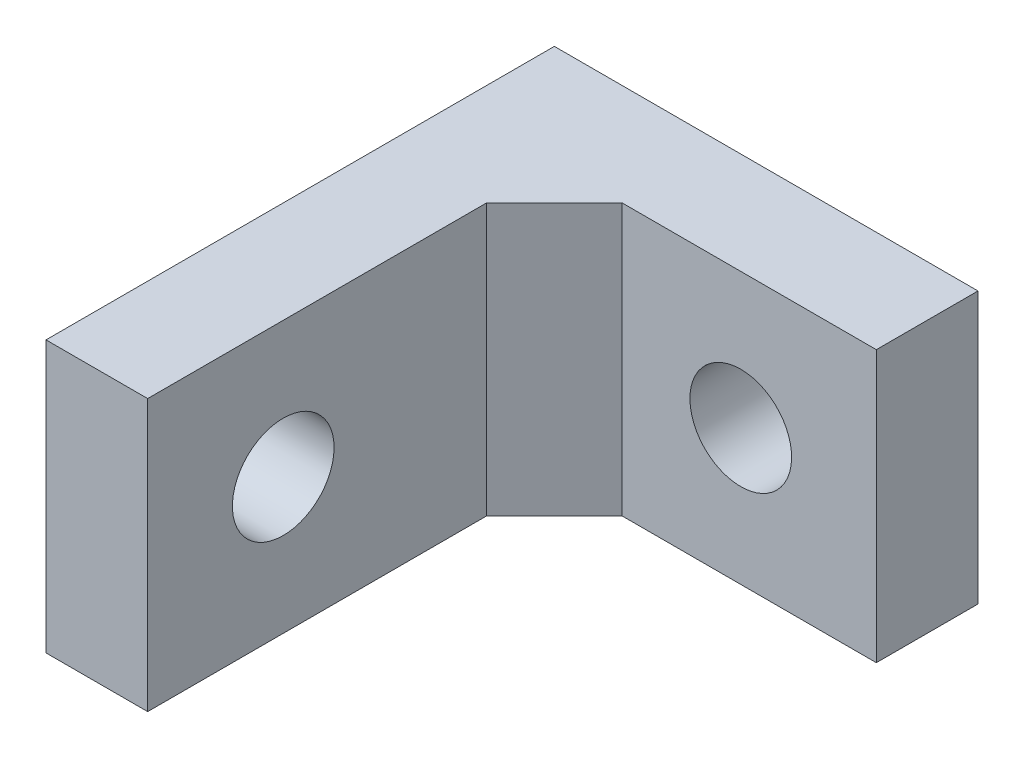
ISO-10303-21;
HEADER;
FILE_DESCRIPTION(('STEP AP214'),'2;1');
FILE_NAME('part.step','',(''),(''),'','','');
FILE_SCHEMA(('AUTOMOTIVE_DESIGN { 1 0 10303 214 1 1 1 1 }'));
ENDSEC;
DATA;
#1=APPLICATION_CONTEXT('core data for automotive mechanical design processes');
#2=APPLICATION_PROTOCOL_DEFINITION('international standard','automotive_design',2000,#1);
#3=PRODUCT_CONTEXT('',#1,'mechanical');
#4=PRODUCT('Part','Part','',(#3));
#5=PRODUCT_RELATED_PRODUCT_CATEGORY('part','',(#4));
#6=PRODUCT_DEFINITION_FORMATION('','',#4);
#7=PRODUCT_DEFINITION_CONTEXT('part definition',#1,'design');
#8=PRODUCT_DEFINITION('design','',#6,#7);
#9=PRODUCT_DEFINITION_SHAPE('','',#8);
#10=(LENGTH_UNIT() NAMED_UNIT(*) SI_UNIT(.MILLI.,.METRE.));
#11=(NAMED_UNIT(*) PLANE_ANGLE_UNIT() SI_UNIT($,.RADIAN.));
#12=(NAMED_UNIT(*) SI_UNIT($,.STERADIAN.) SOLID_ANGLE_UNIT());
#13=UNCERTAINTY_MEASURE_WITH_UNIT(LENGTH_MEASURE(1.E-05),#10,'distance_accuracy_value','');
#14=(GEOMETRIC_REPRESENTATION_CONTEXT(3) GLOBAL_UNCERTAINTY_ASSIGNED_CONTEXT((#13)) GLOBAL_UNIT_ASSIGNED_CONTEXT((#10,
#11,#12)) REPRESENTATION_CONTEXT('',''));
#15=CARTESIAN_POINT('',(0.,0.,0.));
#16=DIRECTION('',(0.,0.,1.));
#17=DIRECTION('',(1.,0.,0.));
#18=AXIS2_PLACEMENT_3D('',#15,#16,#17);
#19=CARTESIAN_POINT('',(3.,0.,0.));
#20=DIRECTION('',(1.,0.,0.));
#21=DIRECTION('',(0.,0.,-1.));
#22=AXIS2_PLACEMENT_3D('',#19,#20,#21);
#23=PLANE('',#22);
#24=DIRECTION('',(0.,0.,-1.));
#25=VECTOR('',#24,1.);
#26=CARTESIAN_POINT('',(3.,-8.,0.));
#27=LINE('',#26,#25);
#28=CARTESIAN_POINT('',(3.,-8.,0.));
#29=VERTEX_POINT('',#28);
#30=CARTESIAN_POINT('',(3.,-8.,-10.));
#31=VERTEX_POINT('',#30);
#32=EDGE_CURVE('E131',#29,#31,#27,.T.);
#33=ORIENTED_EDGE('',*,*,#32,.T.);
#34=DIRECTION('',(0.,1.,0.));
#35=VECTOR('',#34,1.);
#36=CARTESIAN_POINT('',(3.,0.,-10.));
#37=LINE('',#36,#35);
#38=CARTESIAN_POINT('',(3.,0.,-10.));
#39=VERTEX_POINT('',#38);
#40=EDGE_CURVE('E54',#31,#39,#37,.T.);
#41=ORIENTED_EDGE('',*,*,#40,.T.);
#42=DIRECTION('',(0.,0.,1.));
#43=VECTOR('',#42,1.);
#44=CARTESIAN_POINT('',(3.,0.,0.));
#45=LINE('',#44,#43);
#46=CARTESIAN_POINT('',(3.,0.,0.));
#47=VERTEX_POINT('',#46);
#48=EDGE_CURVE('E134',#39,#47,#45,.T.);
#49=ORIENTED_EDGE('',*,*,#48,.T.);
#50=DIRECTION('',(0.,-1.,0.));
#51=VECTOR('',#50,1.);
#52=CARTESIAN_POINT('',(3.,0.,0.));
#53=LINE('',#52,#51);
#54=EDGE_CURVE('E128',#47,#29,#53,.T.);
#55=ORIENTED_EDGE('',*,*,#54,.T.);
#56=EDGE_LOOP('',(#33,#41,#49,#55));
#57=FACE_BOUND('',#56,.T.);
#58=CARTESIAN_POINT('',(3.,-4.,-4.));
#59=DIRECTION('',(1.,0.,0.));
#60=DIRECTION('',(0.,0.,-1.));
#61=AXIS2_PLACEMENT_3D('',#58,#59,#60);
#62=CIRCLE('',#61,1.5);
#63=CARTESIAN_POINT('',(3.,-4.,-5.5));
#64=VERTEX_POINT('',#63);
#65=EDGE_CURVE('E122',#64,#64,#62,.T.);
#66=ORIENTED_EDGE('',*,*,#65,.F.);
#67=EDGE_LOOP('',(#66));
#68=FACE_BOUND('',#67,.T.);
#69=ADVANCED_FACE('F33',(#57,#68),#23,.T.);
#70=CARTESIAN_POINT('',(0.,0.,0.));
#71=DIRECTION('',(1.,0.,0.));
#72=DIRECTION('',(0.,0.,-1.));
#73=AXIS2_PLACEMENT_3D('',#70,#71,#72);
#74=PLANE('',#73);
#75=DIRECTION('',(0.,-1.,0.));
#76=VECTOR('',#75,1.);
#77=CARTESIAN_POINT('',(0.,0.,0.));
#78=LINE('',#77,#76);
#79=CARTESIAN_POINT('',(0.,0.,0.));
#80=VERTEX_POINT('',#79);
#81=CARTESIAN_POINT('',(0.,-8.,0.));
#82=VERTEX_POINT('',#81);
#83=EDGE_CURVE('E125',#80,#82,#78,.T.);
#84=ORIENTED_EDGE('',*,*,#83,.F.);
#85=DIRECTION('',(0.,0.,1.));
#86=VECTOR('',#85,1.);
#87=CARTESIAN_POINT('',(0.,0.,0.));
#88=LINE('',#87,#86);
#89=CARTESIAN_POINT('',(0.,0.,-15.));
#90=VERTEX_POINT('',#89);
#91=EDGE_CURVE('E132',#90,#80,#88,.T.);
#92=ORIENTED_EDGE('',*,*,#91,.F.);
#93=DIRECTION('',(0.,1.,0.));
#94=VECTOR('',#93,1.);
#95=CARTESIAN_POINT('',(0.,0.,-15.));
#96=LINE('',#95,#94);
#97=CARTESIAN_POINT('',(0.,-8.,-15.));
#98=VERTEX_POINT('',#97);
#99=EDGE_CURVE('E141',#98,#90,#96,.T.);
#100=ORIENTED_EDGE('',*,*,#99,.F.);
#101=DIRECTION('',(0.,0.,-1.));
#102=VECTOR('',#101,1.);
#103=CARTESIAN_POINT('',(0.,-8.,0.));
#104=LINE('',#103,#102);
#105=EDGE_CURVE('E139',#82,#98,#104,.T.);
#106=ORIENTED_EDGE('',*,*,#105,.F.);
#107=EDGE_LOOP('',(#84,#92,#100,#106));
#108=FACE_BOUND('',#107,.T.);
#109=CARTESIAN_POINT('',(0.,-4.,-4.));
#110=DIRECTION('',(1.,0.,0.));
#111=DIRECTION('',(0.,0.,-1.));
#112=AXIS2_PLACEMENT_3D('',#109,#110,#111);
#113=CIRCLE('',#112,1.5);
#114=CARTESIAN_POINT('',(0.,-4.,-5.5));
#115=VERTEX_POINT('',#114);
#116=EDGE_CURVE('E120',#115,#115,#113,.T.);
#117=ORIENTED_EDGE('',*,*,#116,.T.);
#118=EDGE_LOOP('',(#117));
#119=FACE_BOUND('',#118,.T.);
#120=ADVANCED_FACE('F166',(#108,#119),#74,.F.);
#121=CARTESIAN_POINT('',(3.,0.,0.));
#122=DIRECTION('',(0.,0.,-1.));
#123=DIRECTION('',(0.,1.,0.));
#124=AXIS2_PLACEMENT_3D('',#121,#122,#123);
#125=PLANE('',#124);
#126=ORIENTED_EDGE('',*,*,#83,.T.);
#127=DIRECTION('',(-1.,0.,0.));
#128=VECTOR('',#127,1.);
#129=CARTESIAN_POINT('',(3.,-8.,0.));
#130=LINE('',#129,#128);
#131=EDGE_CURVE('E151',#29,#82,#130,.T.);
#132=ORIENTED_EDGE('',*,*,#131,.F.);
#133=ORIENTED_EDGE('',*,*,#54,.F.);
#134=DIRECTION('',(-1.,0.,0.));
#135=VECTOR('',#134,1.);
#136=CARTESIAN_POINT('',(3.,0.,0.));
#137=LINE('',#136,#135);
#138=EDGE_CURVE('E136',#47,#80,#137,.T.);
#139=ORIENTED_EDGE('',*,*,#138,.T.);
#140=EDGE_LOOP('',(#126,#132,#133,#139));
#141=FACE_BOUND('',#140,.T.);
#142=ADVANCED_FACE('F170',(#141),#125,.F.);
#143=CARTESIAN_POINT('',(3.,-8.,0.));
#144=DIRECTION('',(0.,1.,0.));
#145=DIRECTION('',(0.,0.,1.));
#146=AXIS2_PLACEMENT_3D('',#143,#144,#145);
#147=PLANE('',#146);
#148=ORIENTED_EDGE('',*,*,#105,.T.);
#149=DIRECTION('',(-1.,0.,0.));
#150=VECTOR('',#149,1.);
#151=CARTESIAN_POINT('',(3.,-8.,-15.));
#152=LINE('',#151,#150);
#153=CARTESIAN_POINT('',(12.5,-8.,-15.));
#154=VERTEX_POINT('',#153);
#155=EDGE_CURVE('E148',#154,#98,#152,.T.);
#156=ORIENTED_EDGE('',*,*,#155,.F.);
#157=DIRECTION('',(0.,0.,-1.));
#158=VECTOR('',#157,1.);
#159=CARTESIAN_POINT('',(12.5,-8.,-12.));
#160=LINE('',#159,#158);
#161=CARTESIAN_POINT('',(12.5,-8.,-12.));
#162=VERTEX_POINT('',#161);
#163=EDGE_CURVE('E110',#162,#154,#160,.T.);
#164=ORIENTED_EDGE('',*,*,#163,.F.);
#165=DIRECTION('',(-1.,0.,0.));
#166=VECTOR('',#165,1.);
#167=CARTESIAN_POINT('',(0.,-8.,-12.));
#168=LINE('',#167,#166);
#169=CARTESIAN_POINT('',(5.00000000000001,-8.,-12.));
#170=VERTEX_POINT('',#169);
#171=EDGE_CURVE('E111',#162,#170,#168,.T.);
#172=ORIENTED_EDGE('',*,*,#171,.T.);
#173=DIRECTION('',(0.707106781186551,0.,-0.707106781186544));
#174=VECTOR('',#173,1.);
#175=CARTESIAN_POINT('',(-2.,-8.,-5.00000000000006));
#176=LINE('',#175,#174);
#177=EDGE_CURVE('E41',#170,#31,#176,.F.);
#178=ORIENTED_EDGE('',*,*,#177,.T.);
#179=ORIENTED_EDGE('',*,*,#32,.F.);
#180=ORIENTED_EDGE('',*,*,#131,.T.);
#181=EDGE_LOOP('',(#148,#156,#164,#172,#178,#179,#180));
#182=FACE_BOUND('',#181,.T.);
#183=ADVANCED_FACE('F157',(#182),#147,.F.);
#184=CARTESIAN_POINT('',(3.,0.,-15.));
#185=DIRECTION('',(0.,0.,1.));
#186=DIRECTION('',(0.,-1.,0.));
#187=AXIS2_PLACEMENT_3D('',#184,#185,#186);
#188=PLANE('',#187);
#189=ORIENTED_EDGE('',*,*,#99,.T.);
#190=DIRECTION('',(-1.,0.,0.));
#191=VECTOR('',#190,1.);
#192=CARTESIAN_POINT('',(3.,0.,-15.));
#193=LINE('',#192,#191);
#194=CARTESIAN_POINT('',(12.5,0.,-15.));
#195=VERTEX_POINT('',#194);
#196=EDGE_CURVE('E146',#195,#90,#193,.T.);
#197=ORIENTED_EDGE('',*,*,#196,.F.);
#198=DIRECTION('',(0.,-1.,0.));
#199=VECTOR('',#198,1.);
#200=CARTESIAN_POINT('',(12.5,0.,-15.));
#201=LINE('',#200,#199);
#202=EDGE_CURVE('E102',#195,#154,#201,.T.);
#203=ORIENTED_EDGE('',*,*,#202,.T.);
#204=ORIENTED_EDGE('',*,*,#155,.T.);
#205=EDGE_LOOP('',(#189,#197,#203,#204));
#206=FACE_BOUND('',#205,.T.);
#207=CARTESIAN_POINT('',(8.5,-4.,-15.));
#208=DIRECTION('',(0.,0.,-1.));
#209=DIRECTION('',(0.,1.,0.));
#210=AXIS2_PLACEMENT_3D('',#207,#208,#209);
#211=CIRCLE('',#210,1.5);
#212=CARTESIAN_POINT('',(8.5,-2.5,-15.));
#213=VERTEX_POINT('',#212);
#214=EDGE_CURVE('E275',#213,#213,#211,.T.);
#215=ORIENTED_EDGE('',*,*,#214,.F.);
#216=EDGE_LOOP('',(#215));
#217=FACE_BOUND('',#216,.T.);
#218=ADVANCED_FACE('F159',(#206,#217),#188,.F.);
#219=CARTESIAN_POINT('',(3.,0.,0.));
#220=DIRECTION('',(0.,-1.,0.));
#221=DIRECTION('',(0.,0.,-1.));
#222=AXIS2_PLACEMENT_3D('',#219,#220,#221);
#223=PLANE('',#222);
#224=ORIENTED_EDGE('',*,*,#48,.F.);
#225=DIRECTION('',(-0.707106781186551,0.,0.707106781186544));
#226=VECTOR('',#225,1.);
#227=CARTESIAN_POINT('',(-2.,0.,-5.00000000000006));
#228=LINE('',#227,#226);
#229=CARTESIAN_POINT('',(5.00000000000002,0.,-12.));
#230=VERTEX_POINT('',#229);
#231=EDGE_CURVE('E11',#39,#230,#228,.F.);
#232=ORIENTED_EDGE('',*,*,#231,.T.);
#233=DIRECTION('',(1.,0.,0.));
#234=VECTOR('',#233,1.);
#235=CARTESIAN_POINT('',(0.,0.,-12.));
#236=LINE('',#235,#234);
#237=CARTESIAN_POINT('',(12.5,0.,-12.));
#238=VERTEX_POINT('',#237);
#239=EDGE_CURVE('E90',#230,#238,#236,.T.);
#240=ORIENTED_EDGE('',*,*,#239,.T.);
#241=DIRECTION('',(0.,0.,-1.));
#242=VECTOR('',#241,1.);
#243=CARTESIAN_POINT('',(12.5,0.,-12.));
#244=LINE('',#243,#242);
#245=EDGE_CURVE('E94',#238,#195,#244,.T.);
#246=ORIENTED_EDGE('',*,*,#245,.T.);
#247=ORIENTED_EDGE('',*,*,#196,.T.);
#248=ORIENTED_EDGE('',*,*,#91,.T.);
#249=ORIENTED_EDGE('',*,*,#138,.F.);
#250=EDGE_LOOP('',(#224,#232,#240,#246,#247,#248,#249));
#251=FACE_BOUND('',#250,.T.);
#252=ADVANCED_FACE('F92',(#251),#223,.F.);
#253=CARTESIAN_POINT('',(3.,-4.,-4.));
#254=DIRECTION('',(-1.,0.,0.));
#255=DIRECTION('',(0.,0.,1.));
#256=AXIS2_PLACEMENT_3D('',#253,#254,#255);
#257=CYLINDRICAL_SURFACE('',#256,1.5);
#258=ORIENTED_EDGE('',*,*,#65,.T.);
#259=EDGE_LOOP('',(#258));
#260=FACE_BOUND('',#259,.T.);
#261=ORIENTED_EDGE('',*,*,#116,.F.);
#262=EDGE_LOOP('',(#261));
#263=FACE_BOUND('',#262,.T.);
#264=ADVANCED_FACE('F187',(#260,#263),#257,.F.);
#265=CARTESIAN_POINT('',(12.5,0.,-12.));
#266=DIRECTION('',(1.,0.,0.));
#267=DIRECTION('',(0.,1.,0.));
#268=AXIS2_PLACEMENT_3D('',#265,#266,#267);
#269=PLANE('',#268);
#270=ORIENTED_EDGE('',*,*,#202,.F.);
#271=ORIENTED_EDGE('',*,*,#245,.F.);
#272=DIRECTION('',(0.,-1.,0.));
#273=VECTOR('',#272,1.);
#274=CARTESIAN_POINT('',(12.5,0.,-12.));
#275=LINE('',#274,#273);
#276=EDGE_CURVE('E101',#238,#162,#275,.T.);
#277=ORIENTED_EDGE('',*,*,#276,.T.);
#278=ORIENTED_EDGE('',*,*,#163,.T.);
#279=EDGE_LOOP('',(#270,#271,#277,#278));
#280=FACE_BOUND('',#279,.T.);
#281=ADVANCED_FACE('F106',(#280),#269,.T.);
#282=CARTESIAN_POINT('',(0.,0.,-12.));
#283=DIRECTION('',(0.,0.,1.));
#284=DIRECTION('',(0.,-1.,0.));
#285=AXIS2_PLACEMENT_3D('',#282,#283,#284);
#286=PLANE('',#285);
#287=CARTESIAN_POINT('',(8.5,-4.,-12.));
#288=DIRECTION('',(0.,0.,-1.));
#289=DIRECTION('',(0.,1.,0.));
#290=AXIS2_PLACEMENT_3D('',#287,#288,#289);
#291=CIRCLE('',#290,1.5);
#292=CARTESIAN_POINT('',(8.5,-2.5,-12.));
#293=VERTEX_POINT('',#292);
#294=EDGE_CURVE('E119',#293,#293,#291,.T.);
#295=ORIENTED_EDGE('',*,*,#294,.T.);
#296=EDGE_LOOP('',(#295));
#297=FACE_BOUND('',#296,.T.);
#298=ORIENTED_EDGE('',*,*,#239,.F.);
#299=DIRECTION('',(0.,-1.,0.));
#300=VECTOR('',#299,1.);
#301=CARTESIAN_POINT('',(5.00000000000002,-8.,-12.));
#302=LINE('',#301,#300);
#303=EDGE_CURVE('E154',#230,#170,#302,.T.);
#304=ORIENTED_EDGE('',*,*,#303,.T.);
#305=ORIENTED_EDGE('',*,*,#171,.F.);
#306=ORIENTED_EDGE('',*,*,#276,.F.);
#307=EDGE_LOOP('',(#298,#304,#305,#306));
#308=FACE_BOUND('',#307,.T.);
#309=ADVANCED_FACE('F113',(#297,#308),#286,.T.);
#310=CARTESIAN_POINT('',(8.5,-4.,-12.));
#311=DIRECTION('',(0.,0.,-1.));
#312=DIRECTION('',(0.,1.,0.));
#313=AXIS2_PLACEMENT_3D('',#310,#311,#312);
#314=CYLINDRICAL_SURFACE('',#313,1.5);
#315=ORIENTED_EDGE('',*,*,#294,.F.);
#316=EDGE_LOOP('',(#315));
#317=FACE_BOUND('',#316,.T.);
#318=ORIENTED_EDGE('',*,*,#214,.T.);
#319=EDGE_LOOP('',(#318));
#320=FACE_BOUND('',#319,.T.);
#321=ADVANCED_FACE('F173',(#317,#320),#314,.F.);
#322=CARTESIAN_POINT('',(5.00000000000002,0.,-12.));
#323=DIRECTION('',(0.707106781186544,0.,0.707106781186551));
#324=DIRECTION('',(0.,1.,0.));
#325=AXIS2_PLACEMENT_3D('',#322,#323,#324);
#326=PLANE('',#325);
#327=ORIENTED_EDGE('',*,*,#231,.F.);
#328=ORIENTED_EDGE('',*,*,#40,.F.);
#329=ORIENTED_EDGE('',*,*,#177,.F.);
#330=ORIENTED_EDGE('',*,*,#303,.F.);
#331=EDGE_LOOP('',(#327,#328,#329,#330));
#332=FACE_BOUND('',#331,.T.);
#333=ADVANCED_FACE('F35',(#332),#326,.T.);
#334=CLOSED_SHELL('',(#69,#120,#142,#183,#218,#252,#264,#281,#309,#321,#333));
#335=MANIFOLD_SOLID_BREP('B2',#334);
#336=ADVANCED_BREP_SHAPE_REPRESENTATION('',(#18,#335),#14);
#337=SHAPE_DEFINITION_REPRESENTATION(#9,#336);
ENDSEC;
END-ISO-10303-21;
